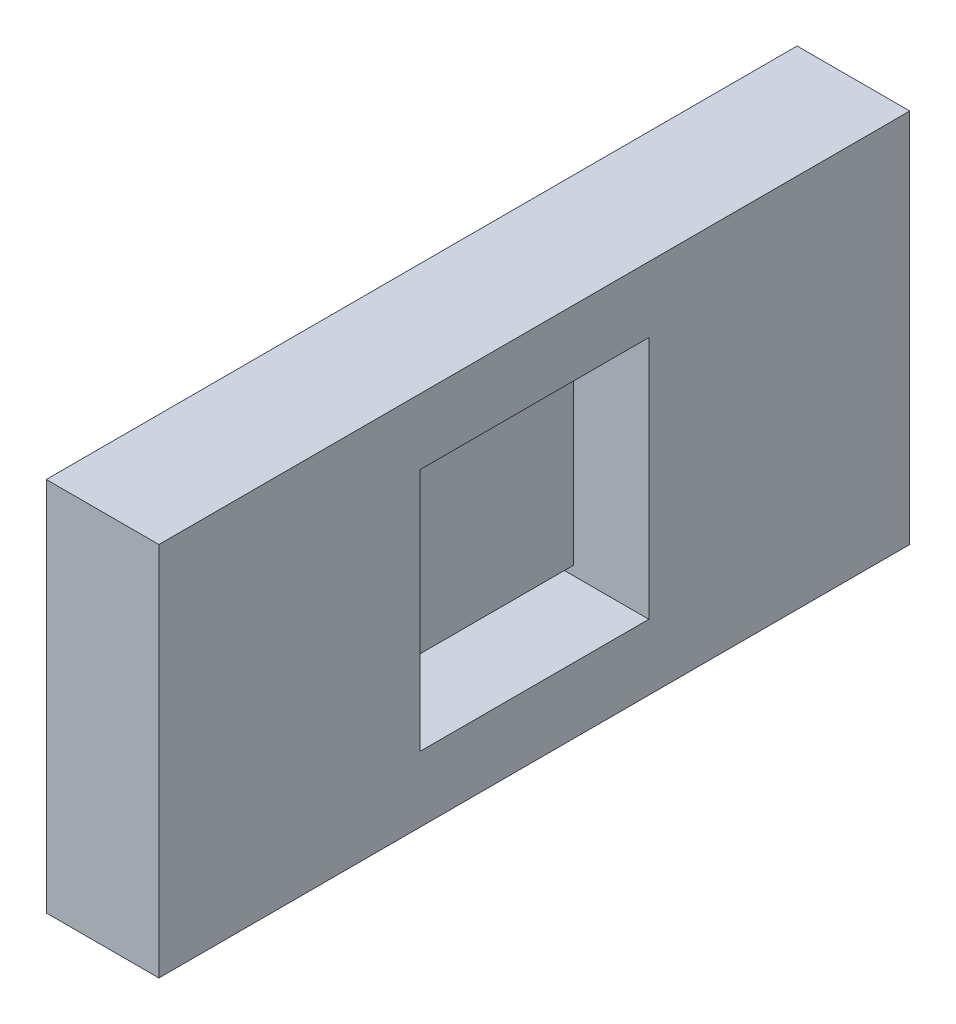
ISO-10303-21;
HEADER;
FILE_DESCRIPTION(('STEP AP214'),'2;1');
FILE_NAME('part.step','',(''),(''),'','','');
FILE_SCHEMA(('AUTOMOTIVE_DESIGN { 1 0 10303 214 1 1 1 1 }'));
ENDSEC;
DATA;
#1=APPLICATION_CONTEXT('core data for automotive mechanical design processes');
#2=APPLICATION_PROTOCOL_DEFINITION('international standard','automotive_design',2000,#1);
#3=PRODUCT_CONTEXT('',#1,'mechanical');
#4=PRODUCT('Part','Part','',(#3));
#5=PRODUCT_RELATED_PRODUCT_CATEGORY('part','',(#4));
#6=PRODUCT_DEFINITION_FORMATION('','',#4);
#7=PRODUCT_DEFINITION_CONTEXT('part definition',#1,'design');
#8=PRODUCT_DEFINITION('design','',#6,#7);
#9=PRODUCT_DEFINITION_SHAPE('','',#8);
#10=(LENGTH_UNIT() NAMED_UNIT(*) SI_UNIT(.MILLI.,.METRE.));
#11=(NAMED_UNIT(*) PLANE_ANGLE_UNIT() SI_UNIT($,.RADIAN.));
#12=(NAMED_UNIT(*) SI_UNIT($,.STERADIAN.) SOLID_ANGLE_UNIT());
#13=UNCERTAINTY_MEASURE_WITH_UNIT(LENGTH_MEASURE(1.E-05),#10,'distance_accuracy_value','');
#14=(GEOMETRIC_REPRESENTATION_CONTEXT(3) GLOBAL_UNCERTAINTY_ASSIGNED_CONTEXT((#13)) GLOBAL_UNIT_ASSIGNED_CONTEXT((#10,
#11,#12)) REPRESENTATION_CONTEXT('',''));
#15=CARTESIAN_POINT('',(0.,0.,0.));
#16=DIRECTION('',(0.,0.,1.));
#17=DIRECTION('',(1.,0.,0.));
#18=AXIS2_PLACEMENT_3D('',#15,#16,#17);
#19=CARTESIAN_POINT('',(2.,0.,0.));
#20=DIRECTION('',(1.,0.,0.));
#21=DIRECTION('',(0.,0.,-1.));
#22=AXIS2_PLACEMENT_3D('',#19,#20,#21);
#23=PLANE('',#22);
#24=DIRECTION('',(0.,0.,-1.));
#25=VECTOR('',#24,1.);
#26=CARTESIAN_POINT('',(2.,12.5,0.));
#27=LINE('',#26,#25);
#28=CARTESIAN_POINT('',(2.,12.5,0.));
#29=VERTEX_POINT('',#28);
#30=CARTESIAN_POINT('',(2.,12.5,-12.2));
#31=VERTEX_POINT('',#30);
#32=EDGE_CURVE('E127',#29,#31,#27,.T.);
#33=ORIENTED_EDGE('',*,*,#32,.F.);
#34=DIRECTION('',(0.,1.,0.));
#35=VECTOR('',#34,1.);
#36=CARTESIAN_POINT('',(2.,0.,0.));
#37=LINE('',#36,#35);
#38=CARTESIAN_POINT('',(2.,0.5,0.));
#39=VERTEX_POINT('',#38);
#40=EDGE_CURVE('E11',#39,#29,#37,.T.);
#41=ORIENTED_EDGE('',*,*,#40,.F.);
#42=DIRECTION('',(0.,0.,1.));
#43=VECTOR('',#42,1.);
#44=CARTESIAN_POINT('',(2.,0.5,0.));
#45=LINE('',#44,#43);
#46=CARTESIAN_POINT('',(2.,0.5,-12.2));
#47=VERTEX_POINT('',#46);
#48=EDGE_CURVE('E146',#47,#39,#45,.T.);
#49=ORIENTED_EDGE('',*,*,#48,.F.);
#50=DIRECTION('',(0.,1.,0.));
#51=VECTOR('',#50,1.);
#52=CARTESIAN_POINT('',(2.,0.,-12.2));
#53=LINE('',#52,#51);
#54=EDGE_CURVE('E43',#47,#31,#53,.T.);
#55=ORIENTED_EDGE('',*,*,#54,.T.);
#56=EDGE_LOOP('',(#33,#41,#49,#55));
#57=FACE_BOUND('',#56,.T.);
#58=ADVANCED_FACE('F34',(#57),#23,.T.);
#59=CARTESIAN_POINT('',(6.,0.,0.));
#60=DIRECTION('',(1.,0.,0.));
#61=DIRECTION('',(0.,0.,-1.));
#62=AXIS2_PLACEMENT_3D('',#59,#60,#61);
#63=PLANE('',#62);
#64=DIRECTION('',(0.,-1.,0.));
#65=VECTOR('',#64,1.);
#66=CARTESIAN_POINT('',(6.,16.5,13.9));
#67=LINE('',#66,#65);
#68=CARTESIAN_POINT('',(6.,16.5,13.9));
#69=VERTEX_POINT('',#68);
#70=CARTESIAN_POINT('',(6.,-3.5,13.9));
#71=VERTEX_POINT('',#70);
#72=EDGE_CURVE('E181',#69,#71,#67,.T.);
#73=ORIENTED_EDGE('',*,*,#72,.T.);
#74=DIRECTION('',(0.,0.,-1.));
#75=VECTOR('',#74,1.);
#76=CARTESIAN_POINT('',(6.,-3.5,13.9));
#77=LINE('',#76,#75);
#78=CARTESIAN_POINT('',(6.,-3.5,-26.1));
#79=VERTEX_POINT('',#78);
#80=EDGE_CURVE('E184',#71,#79,#77,.T.);
#81=ORIENTED_EDGE('',*,*,#80,.T.);
#82=DIRECTION('',(0.,1.,0.));
#83=VECTOR('',#82,1.);
#84=CARTESIAN_POINT('',(6.,16.5,-26.1));
#85=LINE('',#84,#83);
#86=CARTESIAN_POINT('',(6.,16.5,-26.1));
#87=VERTEX_POINT('',#86);
#88=EDGE_CURVE('E187',#79,#87,#85,.T.);
#89=ORIENTED_EDGE('',*,*,#88,.T.);
#90=DIRECTION('',(0.,0.,1.));
#91=VECTOR('',#90,1.);
#92=CARTESIAN_POINT('',(6.,16.5,13.9));
#93=LINE('',#92,#91);
#94=EDGE_CURVE('E189',#87,#69,#93,.T.);
#95=ORIENTED_EDGE('',*,*,#94,.T.);
#96=EDGE_LOOP('',(#73,#81,#89,#95));
#97=FACE_BOUND('',#96,.T.);
#98=DIRECTION('',(0.,0.,-1.));
#99=VECTOR('',#98,1.);
#100=CARTESIAN_POINT('',(6.,0.,0.));
#101=LINE('',#100,#99);
#102=CARTESIAN_POINT('',(6.,0.,0.));
#103=VERTEX_POINT('',#102);
#104=CARTESIAN_POINT('',(6.,0.,-12.2));
#105=VERTEX_POINT('',#104);
#106=EDGE_CURVE('E165',#103,#105,#101,.T.);
#107=ORIENTED_EDGE('',*,*,#106,.F.);
#108=DIRECTION('',(0.,-1.,0.));
#109=VECTOR('',#108,1.);
#110=CARTESIAN_POINT('',(6.,0.,0.));
#111=LINE('',#110,#109);
#112=CARTESIAN_POINT('',(6.,13.,0.));
#113=VERTEX_POINT('',#112);
#114=EDGE_CURVE('E163',#113,#103,#111,.T.);
#115=ORIENTED_EDGE('',*,*,#114,.F.);
#116=DIRECTION('',(0.,0.,1.));
#117=VECTOR('',#116,1.);
#118=CARTESIAN_POINT('',(6.,13.,0.));
#119=LINE('',#118,#117);
#120=CARTESIAN_POINT('',(6.,13.,-12.2));
#121=VERTEX_POINT('',#120);
#122=EDGE_CURVE('E170',#121,#113,#119,.T.);
#123=ORIENTED_EDGE('',*,*,#122,.F.);
#124=DIRECTION('',(0.,1.,0.));
#125=VECTOR('',#124,1.);
#126=CARTESIAN_POINT('',(6.,0.,-12.2));
#127=LINE('',#126,#125);
#128=EDGE_CURVE('E167',#105,#121,#127,.T.);
#129=ORIENTED_EDGE('',*,*,#128,.F.);
#130=EDGE_LOOP('',(#107,#115,#123,#129));
#131=FACE_BOUND('',#130,.T.);
#132=ADVANCED_FACE('F232',(#97,#131),#63,.T.);
#133=CARTESIAN_POINT('',(6.,16.5,13.9));
#134=DIRECTION('',(0.,0.,-1.));
#135=DIRECTION('',(0.,1.,0.));
#136=AXIS2_PLACEMENT_3D('',#133,#134,#135);
#137=PLANE('',#136);
#138=DIRECTION('',(0.,-1.,0.));
#139=VECTOR('',#138,1.);
#140=CARTESIAN_POINT('',(0.,16.5,13.9));
#141=LINE('',#140,#139);
#142=CARTESIAN_POINT('',(0.,16.5,13.9));
#143=VERTEX_POINT('',#142);
#144=CARTESIAN_POINT('',(0.,-3.5,13.9));
#145=VERTEX_POINT('',#144);
#146=EDGE_CURVE('E180',#143,#145,#141,.T.);
#147=ORIENTED_EDGE('',*,*,#146,.T.);
#148=DIRECTION('',(-1.,0.,0.));
#149=VECTOR('',#148,1.);
#150=CARTESIAN_POINT('',(6.,-3.5,13.9));
#151=LINE('',#150,#149);
#152=EDGE_CURVE('E207',#71,#145,#151,.T.);
#153=ORIENTED_EDGE('',*,*,#152,.F.);
#154=ORIENTED_EDGE('',*,*,#72,.F.);
#155=DIRECTION('',(-1.,0.,0.));
#156=VECTOR('',#155,1.);
#157=CARTESIAN_POINT('',(6.,16.5,13.9));
#158=LINE('',#157,#156);
#159=EDGE_CURVE('E191',#69,#143,#158,.T.);
#160=ORIENTED_EDGE('',*,*,#159,.T.);
#161=EDGE_LOOP('',(#147,#153,#154,#160));
#162=FACE_BOUND('',#161,.T.);
#163=ADVANCED_FACE('F219',(#162),#137,.F.);
#164=CARTESIAN_POINT('',(6.,-3.5,13.9));
#165=DIRECTION('',(0.,1.,0.));
#166=DIRECTION('',(0.,0.,1.));
#167=AXIS2_PLACEMENT_3D('',#164,#165,#166);
#168=PLANE('',#167);
#169=DIRECTION('',(0.,0.,-1.));
#170=VECTOR('',#169,1.);
#171=CARTESIAN_POINT('',(0.,-3.5,13.9));
#172=LINE('',#171,#170);
#173=CARTESIAN_POINT('',(0.,-3.5,-26.1));
#174=VERTEX_POINT('',#173);
#175=EDGE_CURVE('E194',#145,#174,#172,.T.);
#176=ORIENTED_EDGE('',*,*,#175,.T.);
#177=DIRECTION('',(-1.,0.,0.));
#178=VECTOR('',#177,1.);
#179=CARTESIAN_POINT('',(6.,-3.5,-26.1));
#180=LINE('',#179,#178);
#181=EDGE_CURVE('E204',#79,#174,#180,.T.);
#182=ORIENTED_EDGE('',*,*,#181,.F.);
#183=ORIENTED_EDGE('',*,*,#80,.F.);
#184=ORIENTED_EDGE('',*,*,#152,.T.);
#185=EDGE_LOOP('',(#176,#182,#183,#184));
#186=FACE_BOUND('',#185,.T.);
#187=ADVANCED_FACE('F214',(#186),#168,.F.);
#188=CARTESIAN_POINT('',(6.,16.5,-26.1));
#189=DIRECTION('',(0.,0.,1.));
#190=DIRECTION('',(0.,-1.,0.));
#191=AXIS2_PLACEMENT_3D('',#188,#189,#190);
#192=PLANE('',#191);
#193=DIRECTION('',(0.,1.,0.));
#194=VECTOR('',#193,1.);
#195=CARTESIAN_POINT('',(0.,16.5,-26.1));
#196=LINE('',#195,#194);
#197=CARTESIAN_POINT('',(0.,16.5,-26.1));
#198=VERTEX_POINT('',#197);
#199=EDGE_CURVE('E196',#174,#198,#196,.T.);
#200=ORIENTED_EDGE('',*,*,#199,.T.);
#201=DIRECTION('',(-1.,0.,0.));
#202=VECTOR('',#201,1.);
#203=CARTESIAN_POINT('',(6.,16.5,-26.1));
#204=LINE('',#203,#202);
#205=EDGE_CURVE('E201',#87,#198,#204,.T.);
#206=ORIENTED_EDGE('',*,*,#205,.F.);
#207=ORIENTED_EDGE('',*,*,#88,.F.);
#208=ORIENTED_EDGE('',*,*,#181,.T.);
#209=EDGE_LOOP('',(#200,#206,#207,#208));
#210=FACE_BOUND('',#209,.T.);
#211=ADVANCED_FACE('F226',(#210),#192,.F.);
#212=CARTESIAN_POINT('',(6.,16.5,13.9));
#213=DIRECTION('',(0.,-1.,0.));
#214=DIRECTION('',(0.,0.,-1.));
#215=AXIS2_PLACEMENT_3D('',#212,#213,#214);
#216=PLANE('',#215);
#217=DIRECTION('',(0.,0.,1.));
#218=VECTOR('',#217,1.);
#219=CARTESIAN_POINT('',(0.,16.5,13.9));
#220=LINE('',#219,#218);
#221=EDGE_CURVE('E185',#198,#143,#220,.T.);
#222=ORIENTED_EDGE('',*,*,#221,.T.);
#223=ORIENTED_EDGE('',*,*,#159,.F.);
#224=ORIENTED_EDGE('',*,*,#94,.F.);
#225=ORIENTED_EDGE('',*,*,#205,.T.);
#226=EDGE_LOOP('',(#222,#223,#224,#225));
#227=FACE_BOUND('',#226,.T.);
#228=ADVANCED_FACE('F230',(#227),#216,.F.);
#229=CARTESIAN_POINT('',(6.,0.,0.));
#230=DIRECTION('',(0.,0.,-1.));
#231=DIRECTION('',(-1.,0.,0.));
#232=AXIS2_PLACEMENT_3D('',#229,#230,#231);
#233=PLANE('',#232);
#234=DIRECTION('',(-1.,0.,0.));
#235=VECTOR('',#234,1.);
#236=CARTESIAN_POINT('',(6.,0.,0.));
#237=LINE('',#236,#235);
#238=CARTESIAN_POINT('',(0.,0.,0.));
#239=VERTEX_POINT('',#238);
#240=EDGE_CURVE('E178',#103,#239,#237,.T.);
#241=ORIENTED_EDGE('',*,*,#240,.T.);
#242=DIRECTION('',(0.,1.,0.));
#243=VECTOR('',#242,1.);
#244=CARTESIAN_POINT('',(0.,0.,0.));
#245=LINE('',#244,#243);
#246=CARTESIAN_POINT('',(0.,0.5,0.));
#247=VERTEX_POINT('',#246);
#248=EDGE_CURVE('E143',#239,#247,#245,.T.);
#249=ORIENTED_EDGE('',*,*,#248,.T.);
#250=DIRECTION('',(1.,0.,0.));
#251=VECTOR('',#250,1.);
#252=CARTESIAN_POINT('',(-12.2102416028513,0.5,0.));
#253=LINE('',#252,#251);
#254=EDGE_CURVE('E141',#247,#39,#253,.T.);
#255=ORIENTED_EDGE('',*,*,#254,.T.);
#256=ORIENTED_EDGE('',*,*,#40,.T.);
#257=DIRECTION('',(1.,0.,0.));
#258=VECTOR('',#257,1.);
#259=CARTESIAN_POINT('',(-12.2102416028513,12.5,0.));
#260=LINE('',#259,#258);
#261=CARTESIAN_POINT('',(0.,12.5,0.));
#262=VERTEX_POINT('',#261);
#263=EDGE_CURVE('E124',#262,#29,#260,.T.);
#264=ORIENTED_EDGE('',*,*,#263,.F.);
#265=DIRECTION('',(0.,1.,0.));
#266=VECTOR('',#265,1.);
#267=CARTESIAN_POINT('',(0.,13.,0.));
#268=LINE('',#267,#266);
#269=CARTESIAN_POINT('',(0.,13.,0.));
#270=VERTEX_POINT('',#269);
#271=EDGE_CURVE('E150',#262,#270,#268,.T.);
#272=ORIENTED_EDGE('',*,*,#271,.T.);
#273=DIRECTION('',(-1.,0.,0.));
#274=VECTOR('',#273,1.);
#275=CARTESIAN_POINT('',(6.,13.,0.));
#276=LINE('',#275,#274);
#277=EDGE_CURVE('E172',#113,#270,#276,.T.);
#278=ORIENTED_EDGE('',*,*,#277,.F.);
#279=ORIENTED_EDGE('',*,*,#114,.T.);
#280=EDGE_LOOP('',(#241,#249,#255,#256,#264,#272,#278,#279));
#281=FACE_BOUND('',#280,.T.);
#282=ADVANCED_FACE('F139',(#281),#233,.T.);
#283=CARTESIAN_POINT('',(6.,0.,0.));
#284=DIRECTION('',(0.,1.,0.));
#285=DIRECTION('',(0.,0.,1.));
#286=AXIS2_PLACEMENT_3D('',#283,#284,#285);
#287=PLANE('',#286);
#288=DIRECTION('',(-1.,0.,0.));
#289=VECTOR('',#288,1.);
#290=CARTESIAN_POINT('',(6.,0.,-12.2));
#291=LINE('',#290,#289);
#292=CARTESIAN_POINT('',(0.,0.,-12.2));
#293=VERTEX_POINT('',#292);
#294=EDGE_CURVE('E176',#105,#293,#291,.T.);
#295=ORIENTED_EDGE('',*,*,#294,.T.);
#296=DIRECTION('',(0.,0.,1.));
#297=VECTOR('',#296,1.);
#298=CARTESIAN_POINT('',(0.,0.,0.));
#299=LINE('',#298,#297);
#300=EDGE_CURVE('E160',#293,#239,#299,.T.);
#301=ORIENTED_EDGE('',*,*,#300,.T.);
#302=ORIENTED_EDGE('',*,*,#240,.F.);
#303=ORIENTED_EDGE('',*,*,#106,.T.);
#304=EDGE_LOOP('',(#295,#301,#302,#303));
#305=FACE_BOUND('',#304,.T.);
#306=ADVANCED_FACE('F243',(#305),#287,.T.);
#307=CARTESIAN_POINT('',(6.,0.,-12.2));
#308=DIRECTION('',(0.,0.,1.));
#309=DIRECTION('',(1.,0.,0.));
#310=AXIS2_PLACEMENT_3D('',#307,#308,#309);
#311=PLANE('',#310);
#312=DIRECTION('',(-1.,0.,0.));
#313=VECTOR('',#312,1.);
#314=CARTESIAN_POINT('',(6.,13.,-12.2));
#315=LINE('',#314,#313);
#316=CARTESIAN_POINT('',(0.,13.,-12.2));
#317=VERTEX_POINT('',#316);
#318=EDGE_CURVE('E174',#121,#317,#315,.T.);
#319=ORIENTED_EDGE('',*,*,#318,.T.);
#320=DIRECTION('',(0.,-1.,0.));
#321=VECTOR('',#320,1.);
#322=CARTESIAN_POINT('',(0.,13.,-12.2));
#323=LINE('',#322,#321);
#324=CARTESIAN_POINT('',(0.,12.5,-12.2));
#325=VERTEX_POINT('',#324);
#326=EDGE_CURVE('E253',#317,#325,#323,.T.);
#327=ORIENTED_EDGE('',*,*,#326,.T.);
#328=DIRECTION('',(1.,0.,0.));
#329=VECTOR('',#328,1.);
#330=CARTESIAN_POINT('',(-12.2102416028513,12.5,-12.2));
#331=LINE('',#330,#329);
#332=EDGE_CURVE('E51',#325,#31,#331,.T.);
#333=ORIENTED_EDGE('',*,*,#332,.T.);
#334=ORIENTED_EDGE('',*,*,#54,.F.);
#335=DIRECTION('',(1.,0.,0.));
#336=VECTOR('',#335,1.);
#337=CARTESIAN_POINT('',(-12.2102416028513,0.5,-12.2));
#338=LINE('',#337,#336);
#339=CARTESIAN_POINT('',(0.,0.5,-12.2));
#340=VERTEX_POINT('',#339);
#341=EDGE_CURVE('E59',#340,#47,#338,.T.);
#342=ORIENTED_EDGE('',*,*,#341,.F.);
#343=DIRECTION('',(0.,-1.,0.));
#344=VECTOR('',#343,1.);
#345=CARTESIAN_POINT('',(0.,0.,-12.2));
#346=LINE('',#345,#344);
#347=EDGE_CURVE('E145',#340,#293,#346,.T.);
#348=ORIENTED_EDGE('',*,*,#347,.T.);
#349=ORIENTED_EDGE('',*,*,#294,.F.);
#350=ORIENTED_EDGE('',*,*,#128,.T.);
#351=EDGE_LOOP('',(#319,#327,#333,#334,#342,#348,#349,#350));
#352=FACE_BOUND('',#351,.T.);
#353=ADVANCED_FACE('F246',(#352),#311,.T.);
#354=CARTESIAN_POINT('',(6.,13.,0.));
#355=DIRECTION('',(0.,-1.,0.));
#356=DIRECTION('',(0.,0.,-1.));
#357=AXIS2_PLACEMENT_3D('',#354,#355,#356);
#358=PLANE('',#357);
#359=ORIENTED_EDGE('',*,*,#277,.T.);
#360=DIRECTION('',(0.,0.,-1.));
#361=VECTOR('',#360,1.);
#362=CARTESIAN_POINT('',(0.,13.,0.));
#363=LINE('',#362,#361);
#364=EDGE_CURVE('E256',#270,#317,#363,.T.);
#365=ORIENTED_EDGE('',*,*,#364,.T.);
#366=ORIENTED_EDGE('',*,*,#318,.F.);
#367=ORIENTED_EDGE('',*,*,#122,.T.);
#368=EDGE_LOOP('',(#359,#365,#366,#367));
#369=FACE_BOUND('',#368,.T.);
#370=ADVANCED_FACE('F264',(#369),#358,.T.);
#371=CARTESIAN_POINT('',(0.,0.,0.));
#372=DIRECTION('',(1.,0.,0.));
#373=DIRECTION('',(0.,0.,-1.));
#374=AXIS2_PLACEMENT_3D('',#371,#372,#373);
#375=PLANE('',#374);
#376=ORIENTED_EDGE('',*,*,#364,.F.);
#377=ORIENTED_EDGE('',*,*,#271,.F.);
#378=DIRECTION('',(0.,0.,1.));
#379=VECTOR('',#378,1.);
#380=CARTESIAN_POINT('',(0.,12.5,0.));
#381=LINE('',#380,#379);
#382=EDGE_CURVE('E130',#325,#262,#381,.T.);
#383=ORIENTED_EDGE('',*,*,#382,.F.);
#384=ORIENTED_EDGE('',*,*,#326,.F.);
#385=EDGE_LOOP('',(#376,#377,#383,#384));
#386=FACE_BOUND('',#385,.T.);
#387=DIRECTION('',(0.,0.,-1.));
#388=VECTOR('',#387,1.);
#389=CARTESIAN_POINT('',(0.,0.5,0.));
#390=LINE('',#389,#388);
#391=EDGE_CURVE('E250',#247,#340,#390,.T.);
#392=ORIENTED_EDGE('',*,*,#391,.F.);
#393=ORIENTED_EDGE('',*,*,#248,.F.);
#394=ORIENTED_EDGE('',*,*,#300,.F.);
#395=ORIENTED_EDGE('',*,*,#347,.F.);
#396=EDGE_LOOP('',(#392,#393,#394,#395));
#397=FACE_BOUND('',#396,.T.);
#398=ORIENTED_EDGE('',*,*,#146,.F.);
#399=ORIENTED_EDGE('',*,*,#221,.F.);
#400=ORIENTED_EDGE('',*,*,#199,.F.);
#401=ORIENTED_EDGE('',*,*,#175,.F.);
#402=EDGE_LOOP('',(#398,#399,#400,#401));
#403=FACE_BOUND('',#402,.T.);
#404=ADVANCED_FACE('F36',(#386,#397,#403),#375,.F.);
#405=CARTESIAN_POINT('',(-12.2102416028513,0.5,0.));
#406=DIRECTION('',(0.,1.,0.));
#407=DIRECTION('',(0.,0.,1.));
#408=AXIS2_PLACEMENT_3D('',#405,#406,#407);
#409=PLANE('',#408);
#410=ORIENTED_EDGE('',*,*,#391,.T.);
#411=ORIENTED_EDGE('',*,*,#341,.T.);
#412=ORIENTED_EDGE('',*,*,#48,.T.);
#413=ORIENTED_EDGE('',*,*,#254,.F.);
#414=EDGE_LOOP('',(#410,#411,#412,#413));
#415=FACE_BOUND('',#414,.T.);
#416=ADVANCED_FACE('F147',(#415),#409,.F.);
#417=CARTESIAN_POINT('',(-12.2102416028513,12.5,0.));
#418=DIRECTION('',(0.,-1.,0.));
#419=DIRECTION('',(0.,0.,-1.));
#420=AXIS2_PLACEMENT_3D('',#417,#418,#419);
#421=PLANE('',#420);
#422=ORIENTED_EDGE('',*,*,#382,.T.);
#423=ORIENTED_EDGE('',*,*,#263,.T.);
#424=ORIENTED_EDGE('',*,*,#32,.T.);
#425=ORIENTED_EDGE('',*,*,#332,.F.);
#426=EDGE_LOOP('',(#422,#423,#424,#425));
#427=FACE_BOUND('',#426,.T.);
#428=ADVANCED_FACE('F126',(#427),#421,.F.);
#429=CLOSED_SHELL('',(#58,#132,#163,#187,#211,#228,#282,#306,#353,#370,#404,#416,#428));
#430=MANIFOLD_SOLID_BREP('B2',#429);
#431=ADVANCED_BREP_SHAPE_REPRESENTATION('',(#18,#430),#14);
#432=SHAPE_DEFINITION_REPRESENTATION(#9,#431);
ENDSEC;
END-ISO-10303-21;
